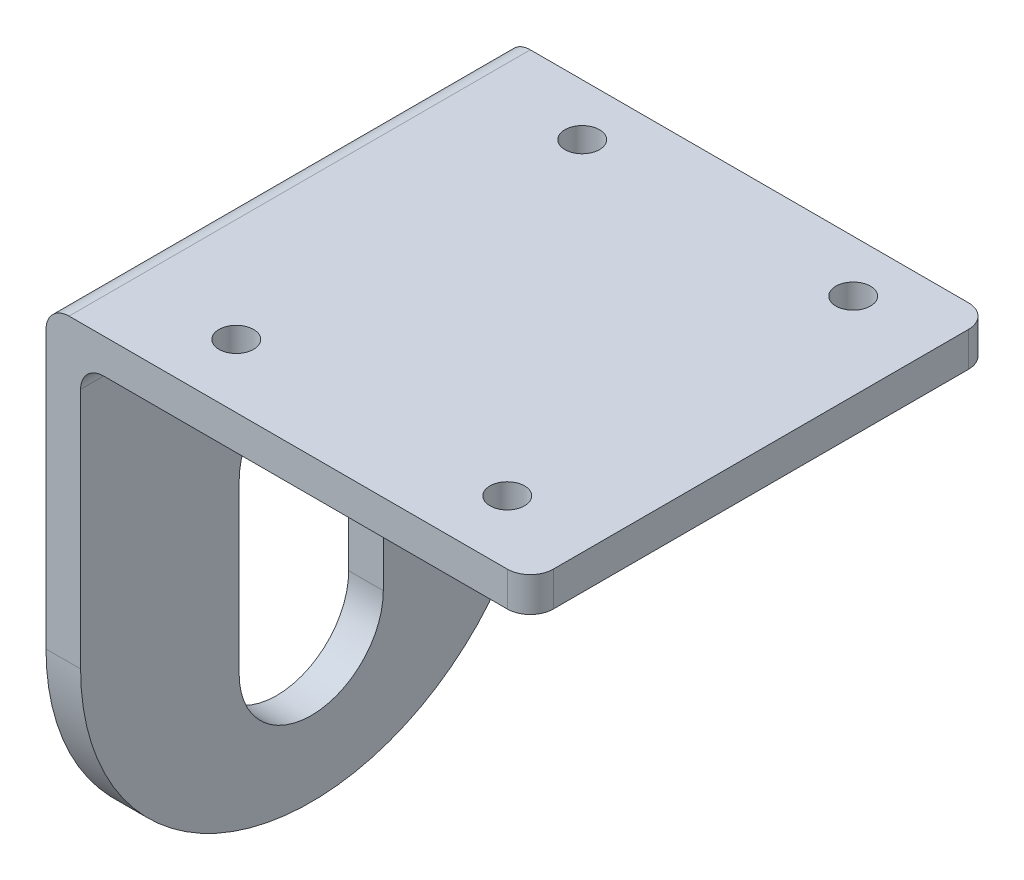
ISO-10303-21;
HEADER;
FILE_DESCRIPTION(('STEP AP214'),'2;1');
FILE_NAME('part.step','',(''),(''),'','','');
FILE_SCHEMA(('AUTOMOTIVE_DESIGN { 1 0 10303 214 1 1 1 1 }'));
ENDSEC;
DATA;
#1=APPLICATION_CONTEXT('core data for automotive mechanical design processes');
#2=APPLICATION_PROTOCOL_DEFINITION('international standard','automotive_design',2000,#1);
#3=PRODUCT_CONTEXT('',#1,'mechanical');
#4=PRODUCT('Part','Part','',(#3));
#5=PRODUCT_RELATED_PRODUCT_CATEGORY('part','',(#4));
#6=PRODUCT_DEFINITION_FORMATION('','',#4);
#7=PRODUCT_DEFINITION_CONTEXT('part definition',#1,'design');
#8=PRODUCT_DEFINITION('design','',#6,#7);
#9=PRODUCT_DEFINITION_SHAPE('','',#8);
#10=(LENGTH_UNIT() NAMED_UNIT(*) SI_UNIT(.MILLI.,.METRE.));
#11=(NAMED_UNIT(*) PLANE_ANGLE_UNIT() SI_UNIT($,.RADIAN.));
#12=(NAMED_UNIT(*) SI_UNIT($,.STERADIAN.) SOLID_ANGLE_UNIT());
#13=UNCERTAINTY_MEASURE_WITH_UNIT(LENGTH_MEASURE(1.E-05),#10,'distance_accuracy_value','');
#14=(GEOMETRIC_REPRESENTATION_CONTEXT(3) GLOBAL_UNCERTAINTY_ASSIGNED_CONTEXT((#13)) GLOBAL_UNIT_ASSIGNED_CONTEXT((#10,
#11,#12)) REPRESENTATION_CONTEXT('',''));
#15=CARTESIAN_POINT('',(0.,0.,0.));
#16=DIRECTION('',(0.,0.,1.));
#17=DIRECTION('',(1.,0.,0.));
#18=AXIS2_PLACEMENT_3D('',#15,#16,#17);
#19=CARTESIAN_POINT('',(0.,3.,-20.));
#20=DIRECTION('',(0.,0.,-1.));
#21=DIRECTION('',(-1.,0.,0.));
#22=AXIS2_PLACEMENT_3D('',#19,#20,#21);
#23=PLANE('',#22);
#24=DIRECTION('',(0.,-1.,0.));
#25=VECTOR('',#24,1.);
#26=CARTESIAN_POINT('',(-21.,-23.,-20.));
#27=LINE('',#26,#25);
#28=CARTESIAN_POINT('',(-21.,1.,-20.));
#29=VERTEX_POINT('',#28);
#30=CARTESIAN_POINT('',(-21.,-23.,-20.));
#31=VERTEX_POINT('',#30);
#32=EDGE_CURVE('E177',#29,#31,#27,.T.);
#33=ORIENTED_EDGE('',*,*,#32,.F.);
#34=CARTESIAN_POINT('',(-19.,1.,-20.));
#35=DIRECTION('',(0.,0.,-1.));
#36=DIRECTION('',(-1.,0.,0.));
#37=AXIS2_PLACEMENT_3D('',#34,#35,#36);
#38=CIRCLE('',#37,2.);
#39=CARTESIAN_POINT('',(-19.,3.,-20.));
#40=VERTEX_POINT('',#39);
#41=EDGE_CURVE('E257',#29,#40,#38,.T.);
#42=ORIENTED_EDGE('',*,*,#41,.T.);
#43=DIRECTION('',(1.,0.,0.));
#44=VECTOR('',#43,1.);
#45=CARTESIAN_POINT('',(0.,3.,-20.));
#46=LINE('',#45,#44);
#47=CARTESIAN_POINT('',(19.,3.,-20.));
#48=VERTEX_POINT('',#47);
#49=EDGE_CURVE('E211',#40,#48,#46,.T.);
#50=ORIENTED_EDGE('',*,*,#49,.T.);
#51=DIRECTION('',(0.,-1.,0.));
#52=VECTOR('',#51,1.);
#53=CARTESIAN_POINT('',(19.,3.,-20.));
#54=LINE('',#53,#52);
#55=CARTESIAN_POINT('',(19.,0.,-20.));
#56=VERTEX_POINT('',#55);
#57=EDGE_CURVE('E247',#48,#56,#54,.T.);
#58=ORIENTED_EDGE('',*,*,#57,.T.);
#59=DIRECTION('',(1.,0.,0.));
#60=VECTOR('',#59,1.);
#61=CARTESIAN_POINT('',(0.,0.,-20.));
#62=LINE('',#61,#60);
#63=CARTESIAN_POINT('',(-16.,0.,-20.));
#64=VERTEX_POINT('',#63);
#65=EDGE_CURVE('E237',#64,#56,#62,.T.);
#66=ORIENTED_EDGE('',*,*,#65,.F.);
#67=CARTESIAN_POINT('',(-16.,-2.,-20.));
#68=DIRECTION('',(0.,0.,-1.));
#69=DIRECTION('',(-1.,0.,0.));
#70=AXIS2_PLACEMENT_3D('',#67,#68,#69);
#71=CIRCLE('',#70,2.);
#72=CARTESIAN_POINT('',(-18.,-2.,-20.));
#73=VERTEX_POINT('',#72);
#74=EDGE_CURVE('E11',#64,#73,#71,.F.);
#75=ORIENTED_EDGE('',*,*,#74,.T.);
#76=DIRECTION('',(0.,-1.,0.));
#77=VECTOR('',#76,1.);
#78=CARTESIAN_POINT('',(-18.,-23.,-20.));
#79=LINE('',#78,#77);
#80=CARTESIAN_POINT('',(-18.,-23.,-20.));
#81=VERTEX_POINT('',#80);
#82=EDGE_CURVE('E153',#73,#81,#79,.T.);
#83=ORIENTED_EDGE('',*,*,#82,.T.);
#84=DIRECTION('',(1.,0.,0.));
#85=VECTOR('',#84,1.);
#86=CARTESIAN_POINT('',(-21.,-23.,-20.));
#87=LINE('',#86,#85);
#88=EDGE_CURVE('E192',#31,#81,#87,.T.);
#89=ORIENTED_EDGE('',*,*,#88,.F.);
#90=EDGE_LOOP('',(#33,#42,#50,#58,#66,#75,#83,#89));
#91=FACE_BOUND('',#90,.T.);
#92=ADVANCED_FACE('F34',(#91),#23,.T.);
#93=CARTESIAN_POINT('',(0.,3.,20.));
#94=DIRECTION('',(0.,0.,1.));
#95=DIRECTION('',(1.,0.,0.));
#96=AXIS2_PLACEMENT_3D('',#93,#94,#95);
#97=PLANE('',#96);
#98=DIRECTION('',(-1.,0.,0.));
#99=VECTOR('',#98,1.);
#100=CARTESIAN_POINT('',(0.,3.,20.));
#101=LINE('',#100,#99);
#102=CARTESIAN_POINT('',(19.,3.,20.));
#103=VERTEX_POINT('',#102);
#104=CARTESIAN_POINT('',(-19.,3.,20.));
#105=VERTEX_POINT('',#104);
#106=EDGE_CURVE('E213',#103,#105,#101,.T.);
#107=ORIENTED_EDGE('',*,*,#106,.T.);
#108=CARTESIAN_POINT('',(-19.,1.,20.));
#109=DIRECTION('',(0.,0.,1.));
#110=DIRECTION('',(1.,0.,0.));
#111=AXIS2_PLACEMENT_3D('',#108,#109,#110);
#112=CIRCLE('',#111,2.);
#113=CARTESIAN_POINT('',(-21.,1.,20.));
#114=VERTEX_POINT('',#113);
#115=EDGE_CURVE('E261',#105,#114,#112,.T.);
#116=ORIENTED_EDGE('',*,*,#115,.T.);
#117=DIRECTION('',(0.,1.,0.));
#118=VECTOR('',#117,1.);
#119=CARTESIAN_POINT('',(-21.,3.,20.));
#120=LINE('',#119,#118);
#121=CARTESIAN_POINT('',(-21.,-23.,20.));
#122=VERTEX_POINT('',#121);
#123=EDGE_CURVE('E182',#122,#114,#120,.T.);
#124=ORIENTED_EDGE('',*,*,#123,.F.);
#125=DIRECTION('',(1.,0.,0.));
#126=VECTOR('',#125,1.);
#127=CARTESIAN_POINT('',(-21.,-23.,20.));
#128=LINE('',#127,#126);
#129=CARTESIAN_POINT('',(-18.,-23.,20.));
#130=VERTEX_POINT('',#129);
#131=EDGE_CURVE('E185',#122,#130,#128,.T.);
#132=ORIENTED_EDGE('',*,*,#131,.T.);
#133=DIRECTION('',(0.,1.,0.));
#134=VECTOR('',#133,1.);
#135=CARTESIAN_POINT('',(-18.,3.,20.));
#136=LINE('',#135,#134);
#137=CARTESIAN_POINT('',(-18.,-2.,20.));
#138=VERTEX_POINT('',#137);
#139=EDGE_CURVE('E180',#130,#138,#136,.T.);
#140=ORIENTED_EDGE('',*,*,#139,.T.);
#141=CARTESIAN_POINT('',(-16.,-2.,20.));
#142=DIRECTION('',(0.,0.,1.));
#143=DIRECTION('',(1.,0.,0.));
#144=AXIS2_PLACEMENT_3D('',#141,#142,#143);
#145=CIRCLE('',#144,2.);
#146=CARTESIAN_POINT('',(-16.,0.,20.));
#147=VERTEX_POINT('',#146);
#148=EDGE_CURVE('E42',#138,#147,#145,.F.);
#149=ORIENTED_EDGE('',*,*,#148,.T.);
#150=DIRECTION('',(-1.,0.,0.));
#151=VECTOR('',#150,1.);
#152=CARTESIAN_POINT('',(0.,0.,20.));
#153=LINE('',#152,#151);
#154=CARTESIAN_POINT('',(19.,0.,20.));
#155=VERTEX_POINT('',#154);
#156=EDGE_CURVE('E239',#155,#147,#153,.T.);
#157=ORIENTED_EDGE('',*,*,#156,.F.);
#158=DIRECTION('',(0.,-1.,0.));
#159=VECTOR('',#158,1.);
#160=CARTESIAN_POINT('',(19.,3.,20.));
#161=LINE('',#160,#159);
#162=EDGE_CURVE('E222',#103,#155,#161,.T.);
#163=ORIENTED_EDGE('',*,*,#162,.F.);
#164=EDGE_LOOP('',(#107,#116,#124,#132,#140,#149,#157,#163));
#165=FACE_BOUND('',#164,.T.);
#166=ADVANCED_FACE('F274',(#165),#97,.T.);
#167=CARTESIAN_POINT('',(0.,3.,0.));
#168=DIRECTION('',(0.,1.,0.));
#169=DIRECTION('',(0.,0.,1.));
#170=AXIS2_PLACEMENT_3D('',#167,#168,#169);
#171=PLANE('',#170);
#172=CARTESIAN_POINT('',(13.5,3.,14.5));
#173=DIRECTION('',(0.,1.,0.));
#174=DIRECTION('',(0.,0.,1.));
#175=AXIS2_PLACEMENT_3D('',#172,#173,#174);
#176=CIRCLE('',#175,1.5);
#177=CARTESIAN_POINT('',(13.5,3.,16.));
#178=VERTEX_POINT('',#177);
#179=EDGE_CURVE('E196',#178,#178,#176,.T.);
#180=ORIENTED_EDGE('',*,*,#179,.F.);
#181=EDGE_LOOP('',(#180));
#182=FACE_BOUND('',#181,.T.);
#183=CARTESIAN_POINT('',(-9.99999999999999,3.,14.5));
#184=DIRECTION('',(0.,1.,0.));
#185=DIRECTION('',(0.,0.,1.));
#186=AXIS2_PLACEMENT_3D('',#183,#184,#185);
#187=CIRCLE('',#186,1.5);
#188=CARTESIAN_POINT('',(-9.99999999999999,3.,16.));
#189=VERTEX_POINT('',#188);
#190=EDGE_CURVE('E199',#189,#189,#187,.T.);
#191=ORIENTED_EDGE('',*,*,#190,.F.);
#192=EDGE_LOOP('',(#191));
#193=FACE_BOUND('',#192,.T.);
#194=CARTESIAN_POINT('',(-10.,3.,-15.5));
#195=DIRECTION('',(0.,1.,0.));
#196=DIRECTION('',(0.,0.,1.));
#197=AXIS2_PLACEMENT_3D('',#194,#195,#196);
#198=CIRCLE('',#197,1.5);
#199=CARTESIAN_POINT('',(-10.,3.,-14.));
#200=VERTEX_POINT('',#199);
#201=EDGE_CURVE('E216',#200,#200,#198,.T.);
#202=ORIENTED_EDGE('',*,*,#201,.F.);
#203=EDGE_LOOP('',(#202));
#204=FACE_BOUND('',#203,.T.);
#205=CARTESIAN_POINT('',(13.5,3.,-15.5));
#206=DIRECTION('',(0.,1.,0.));
#207=DIRECTION('',(0.,0.,1.));
#208=AXIS2_PLACEMENT_3D('',#205,#206,#207);
#209=CIRCLE('',#208,1.5);
#210=CARTESIAN_POINT('',(13.5,3.,-14.));
#211=VERTEX_POINT('',#210);
#212=EDGE_CURVE('E219',#211,#211,#209,.T.);
#213=ORIENTED_EDGE('',*,*,#212,.F.);
#214=EDGE_LOOP('',(#213));
#215=FACE_BOUND('',#214,.T.);
#216=ORIENTED_EDGE('',*,*,#49,.F.);
#217=DIRECTION('',(0.,0.,-1.));
#218=VECTOR('',#217,1.);
#219=CARTESIAN_POINT('',(-19.,3.,0.));
#220=LINE('',#219,#218);
#221=EDGE_CURVE('E259',#40,#105,#220,.F.);
#222=ORIENTED_EDGE('',*,*,#221,.T.);
#223=ORIENTED_EDGE('',*,*,#106,.F.);
#224=CARTESIAN_POINT('',(19.,3.,18.));
#225=DIRECTION('',(0.,1.,0.));
#226=DIRECTION('',(0.,0.,1.));
#227=AXIS2_PLACEMENT_3D('',#224,#225,#226);
#228=CIRCLE('',#227,2.);
#229=CARTESIAN_POINT('',(21.,3.,18.));
#230=VERTEX_POINT('',#229);
#231=EDGE_CURVE('E203',#230,#103,#228,.F.);
#232=ORIENTED_EDGE('',*,*,#231,.F.);
#233=DIRECTION('',(0.,0.,-1.));
#234=VECTOR('',#233,1.);
#235=CARTESIAN_POINT('',(21.,3.,0.));
#236=LINE('',#235,#234);
#237=CARTESIAN_POINT('',(21.,3.,-18.));
#238=VERTEX_POINT('',#237);
#239=EDGE_CURVE('E206',#230,#238,#236,.T.);
#240=ORIENTED_EDGE('',*,*,#239,.T.);
#241=CARTESIAN_POINT('',(19.,3.,-18.));
#242=DIRECTION('',(0.,1.,0.));
#243=DIRECTION('',(0.,0.,1.));
#244=AXIS2_PLACEMENT_3D('',#241,#242,#243);
#245=CIRCLE('',#244,2.);
#246=EDGE_CURVE('E208',#48,#238,#245,.F.);
#247=ORIENTED_EDGE('',*,*,#246,.F.);
#248=EDGE_LOOP('',(#216,#222,#223,#232,#240,#247));
#249=FACE_BOUND('',#248,.T.);
#250=ADVANCED_FACE('F295',(#182,#193,#204,#215,#249),#171,.T.);
#251=CARTESIAN_POINT('',(0.,0.,0.));
#252=DIRECTION('',(0.,1.,0.));
#253=DIRECTION('',(0.,0.,1.));
#254=AXIS2_PLACEMENT_3D('',#251,#252,#253);
#255=PLANE('',#254);
#256=CARTESIAN_POINT('',(13.5,0.,-15.5));
#257=DIRECTION('',(0.,1.,0.));
#258=DIRECTION('',(0.,0.,1.));
#259=AXIS2_PLACEMENT_3D('',#256,#257,#258);
#260=CIRCLE('',#259,1.5);
#261=CARTESIAN_POINT('',(13.5,0.,-14.));
#262=VERTEX_POINT('',#261);
#263=EDGE_CURVE('E200',#262,#262,#260,.T.);
#264=ORIENTED_EDGE('',*,*,#263,.T.);
#265=EDGE_LOOP('',(#264));
#266=FACE_BOUND('',#265,.T.);
#267=CARTESIAN_POINT('',(-10.,0.,-15.5));
#268=DIRECTION('',(0.,1.,0.));
#269=DIRECTION('',(0.,0.,1.));
#270=AXIS2_PLACEMENT_3D('',#267,#268,#269);
#271=CIRCLE('',#270,1.5);
#272=CARTESIAN_POINT('',(-10.,0.,-14.));
#273=VERTEX_POINT('',#272);
#274=EDGE_CURVE('E241',#273,#273,#271,.T.);
#275=ORIENTED_EDGE('',*,*,#274,.T.);
#276=EDGE_LOOP('',(#275));
#277=FACE_BOUND('',#276,.T.);
#278=CARTESIAN_POINT('',(-9.99999999999999,0.,14.5));
#279=DIRECTION('',(0.,1.,0.));
#280=DIRECTION('',(0.,0.,1.));
#281=AXIS2_PLACEMENT_3D('',#278,#279,#280);
#282=CIRCLE('',#281,1.5);
#283=CARTESIAN_POINT('',(-9.99999999999999,0.,16.));
#284=VERTEX_POINT('',#283);
#285=EDGE_CURVE('E225',#284,#284,#282,.T.);
#286=ORIENTED_EDGE('',*,*,#285,.T.);
#287=EDGE_LOOP('',(#286));
#288=FACE_BOUND('',#287,.T.);
#289=CARTESIAN_POINT('',(13.5,0.,14.5));
#290=DIRECTION('',(0.,1.,0.));
#291=DIRECTION('',(0.,0.,1.));
#292=AXIS2_PLACEMENT_3D('',#289,#290,#291);
#293=CIRCLE('',#292,1.5);
#294=CARTESIAN_POINT('',(13.5,0.,16.));
#295=VERTEX_POINT('',#294);
#296=EDGE_CURVE('E195',#295,#295,#293,.T.);
#297=ORIENTED_EDGE('',*,*,#296,.T.);
#298=EDGE_LOOP('',(#297));
#299=FACE_BOUND('',#298,.T.);
#300=ORIENTED_EDGE('',*,*,#156,.T.);
#301=DIRECTION('',(0.,0.,1.));
#302=VECTOR('',#301,1.);
#303=CARTESIAN_POINT('',(-16.,0.,-20.));
#304=LINE('',#303,#302);
#305=EDGE_CURVE('E55',#147,#64,#304,.F.);
#306=ORIENTED_EDGE('',*,*,#305,.T.);
#307=ORIENTED_EDGE('',*,*,#65,.T.);
#308=CARTESIAN_POINT('',(19.,0.,-18.));
#309=DIRECTION('',(0.,1.,0.));
#310=DIRECTION('',(0.,0.,1.));
#311=AXIS2_PLACEMENT_3D('',#308,#309,#310);
#312=CIRCLE('',#311,2.);
#313=CARTESIAN_POINT('',(21.,0.,-18.));
#314=VERTEX_POINT('',#313);
#315=EDGE_CURVE('E234',#56,#314,#312,.F.);
#316=ORIENTED_EDGE('',*,*,#315,.T.);
#317=DIRECTION('',(0.,0.,-1.));
#318=VECTOR('',#317,1.);
#319=CARTESIAN_POINT('',(21.,0.,0.));
#320=LINE('',#319,#318);
#321=CARTESIAN_POINT('',(21.,0.,18.));
#322=VERTEX_POINT('',#321);
#323=EDGE_CURVE('E231',#322,#314,#320,.T.);
#324=ORIENTED_EDGE('',*,*,#323,.F.);
#325=CARTESIAN_POINT('',(19.,0.,18.));
#326=DIRECTION('',(0.,1.,0.));
#327=DIRECTION('',(0.,0.,1.));
#328=AXIS2_PLACEMENT_3D('',#325,#326,#327);
#329=CIRCLE('',#328,2.);
#330=EDGE_CURVE('E228',#322,#155,#329,.F.);
#331=ORIENTED_EDGE('',*,*,#330,.T.);
#332=EDGE_LOOP('',(#300,#306,#307,#316,#324,#331));
#333=FACE_BOUND('',#332,.T.);
#334=ADVANCED_FACE('F311',(#266,#277,#288,#299,#333),#255,.F.);
#335=CARTESIAN_POINT('',(19.,3.,18.));
#336=DIRECTION('',(0.,-1.,0.));
#337=DIRECTION('',(0.,0.,-1.));
#338=AXIS2_PLACEMENT_3D('',#335,#336,#337);
#339=CYLINDRICAL_SURFACE('',#338,2.);
#340=ORIENTED_EDGE('',*,*,#330,.F.);
#341=DIRECTION('',(0.,-1.,0.));
#342=VECTOR('',#341,1.);
#343=CARTESIAN_POINT('',(21.,3.,18.));
#344=LINE('',#343,#342);
#345=EDGE_CURVE('E252',#230,#322,#344,.T.);
#346=ORIENTED_EDGE('',*,*,#345,.F.);
#347=ORIENTED_EDGE('',*,*,#231,.T.);
#348=ORIENTED_EDGE('',*,*,#162,.T.);
#349=EDGE_LOOP('',(#340,#346,#347,#348));
#350=FACE_BOUND('',#349,.T.);
#351=ADVANCED_FACE('F307',(#350),#339,.T.);
#352=CARTESIAN_POINT('',(21.,3.,0.));
#353=DIRECTION('',(-1.,0.,0.));
#354=DIRECTION('',(0.,0.,1.));
#355=AXIS2_PLACEMENT_3D('',#352,#353,#354);
#356=PLANE('',#355);
#357=ORIENTED_EDGE('',*,*,#323,.T.);
#358=DIRECTION('',(0.,-1.,0.));
#359=VECTOR('',#358,1.);
#360=CARTESIAN_POINT('',(21.,3.,-18.));
#361=LINE('',#360,#359);
#362=EDGE_CURVE('E250',#238,#314,#361,.T.);
#363=ORIENTED_EDGE('',*,*,#362,.F.);
#364=ORIENTED_EDGE('',*,*,#239,.F.);
#365=ORIENTED_EDGE('',*,*,#345,.T.);
#366=EDGE_LOOP('',(#357,#363,#364,#365));
#367=FACE_BOUND('',#366,.T.);
#368=ADVANCED_FACE('F303',(#367),#356,.F.);
#369=CARTESIAN_POINT('',(19.,3.,-18.));
#370=DIRECTION('',(0.,-1.,0.));
#371=DIRECTION('',(0.,0.,-1.));
#372=AXIS2_PLACEMENT_3D('',#369,#370,#371);
#373=CYLINDRICAL_SURFACE('',#372,2.);
#374=ORIENTED_EDGE('',*,*,#315,.F.);
#375=ORIENTED_EDGE('',*,*,#57,.F.);
#376=ORIENTED_EDGE('',*,*,#246,.T.);
#377=ORIENTED_EDGE('',*,*,#362,.T.);
#378=EDGE_LOOP('',(#374,#375,#376,#377));
#379=FACE_BOUND('',#378,.T.);
#380=ADVANCED_FACE('F299',(#379),#373,.T.);
#381=CARTESIAN_POINT('',(-10.,3.,-15.5));
#382=DIRECTION('',(0.,-1.,0.));
#383=DIRECTION('',(0.,0.,-1.));
#384=AXIS2_PLACEMENT_3D('',#381,#382,#383);
#385=CYLINDRICAL_SURFACE('',#384,1.5);
#386=ORIENTED_EDGE('',*,*,#201,.T.);
#387=EDGE_LOOP('',(#386));
#388=FACE_BOUND('',#387,.T.);
#389=ORIENTED_EDGE('',*,*,#274,.F.);
#390=EDGE_LOOP('',(#389));
#391=FACE_BOUND('',#390,.T.);
#392=ADVANCED_FACE('F302',(#388,#391),#385,.F.);
#393=CARTESIAN_POINT('',(-9.99999999999999,3.,14.5));
#394=DIRECTION('',(0.,-1.,0.));
#395=DIRECTION('',(0.,0.,-1.));
#396=AXIS2_PLACEMENT_3D('',#393,#394,#395);
#397=CYLINDRICAL_SURFACE('',#396,1.5);
#398=ORIENTED_EDGE('',*,*,#190,.T.);
#399=EDGE_LOOP('',(#398));
#400=FACE_BOUND('',#399,.T.);
#401=ORIENTED_EDGE('',*,*,#285,.F.);
#402=EDGE_LOOP('',(#401));
#403=FACE_BOUND('',#402,.T.);
#404=ADVANCED_FACE('F313',(#400,#403),#397,.F.);
#405=CARTESIAN_POINT('',(13.5,3.,14.5));
#406=DIRECTION('',(0.,-1.,0.));
#407=DIRECTION('',(0.,0.,-1.));
#408=AXIS2_PLACEMENT_3D('',#405,#406,#407);
#409=CYLINDRICAL_SURFACE('',#408,1.5);
#410=ORIENTED_EDGE('',*,*,#179,.T.);
#411=EDGE_LOOP('',(#410));
#412=FACE_BOUND('',#411,.T.);
#413=ORIENTED_EDGE('',*,*,#296,.F.);
#414=EDGE_LOOP('',(#413));
#415=FACE_BOUND('',#414,.T.);
#416=ADVANCED_FACE('F316',(#412,#415),#409,.F.);
#417=CARTESIAN_POINT('',(13.5,3.,-15.5));
#418=DIRECTION('',(0.,-1.,0.));
#419=DIRECTION('',(0.,0.,-1.));
#420=AXIS2_PLACEMENT_3D('',#417,#418,#419);
#421=CYLINDRICAL_SURFACE('',#420,1.5);
#422=ORIENTED_EDGE('',*,*,#212,.T.);
#423=EDGE_LOOP('',(#422));
#424=FACE_BOUND('',#423,.T.);
#425=ORIENTED_EDGE('',*,*,#263,.F.);
#426=EDGE_LOOP('',(#425));
#427=FACE_BOUND('',#426,.T.);
#428=ADVANCED_FACE('F319',(#424,#427),#421,.F.);
#429=CARTESIAN_POINT('',(-18.,-23.,0.));
#430=DIRECTION('',(-1.,0.,0.));
#431=DIRECTION('',(0.,0.,1.));
#432=AXIS2_PLACEMENT_3D('',#429,#430,#431);
#433=PLANE('',#432);
#434=CARTESIAN_POINT('',(-18.,-30.25,0.));
#435=DIRECTION('',(-1.,0.,0.));
#436=DIRECTION('',(0.,0.,1.));
#437=AXIS2_PLACEMENT_3D('',#434,#435,#436);
#438=CIRCLE('',#437,6.25);
#439=CARTESIAN_POINT('',(-18.,-30.25,-6.25));
#440=VERTEX_POINT('',#439);
#441=CARTESIAN_POINT('',(-18.,-30.25,6.25));
#442=VERTEX_POINT('',#441);
#443=EDGE_CURVE('E165',#440,#442,#438,.T.);
#444=ORIENTED_EDGE('',*,*,#443,.T.);
#445=DIRECTION('',(0.,1.,0.));
#446=VECTOR('',#445,1.);
#447=CARTESIAN_POINT('',(-18.,-30.25,6.25));
#448=LINE('',#447,#446);
#449=CARTESIAN_POINT('',(-18.,-15.75,6.25));
#450=VERTEX_POINT('',#449);
#451=EDGE_CURVE('E152',#442,#450,#448,.T.);
#452=ORIENTED_EDGE('',*,*,#451,.T.);
#453=CARTESIAN_POINT('',(-18.,-15.75,0.));
#454=DIRECTION('',(-1.,0.,0.));
#455=DIRECTION('',(0.,0.,1.));
#456=AXIS2_PLACEMENT_3D('',#453,#454,#455);
#457=CIRCLE('',#456,6.25);
#458=CARTESIAN_POINT('',(-18.,-15.75,-6.25));
#459=VERTEX_POINT('',#458);
#460=EDGE_CURVE('E168',#450,#459,#457,.T.);
#461=ORIENTED_EDGE('',*,*,#460,.T.);
#462=DIRECTION('',(0.,-1.,0.));
#463=VECTOR('',#462,1.);
#464=CARTESIAN_POINT('',(-18.,-30.25,-6.25));
#465=LINE('',#464,#463);
#466=EDGE_CURVE('E146',#459,#440,#465,.T.);
#467=ORIENTED_EDGE('',*,*,#466,.T.);
#468=EDGE_LOOP('',(#444,#452,#461,#467));
#469=FACE_BOUND('',#468,.T.);
#470=ORIENTED_EDGE('',*,*,#82,.F.);
#471=DIRECTION('',(0.,0.,1.));
#472=VECTOR('',#471,1.);
#473=CARTESIAN_POINT('',(-18.,-2.,20.));
#474=LINE('',#473,#472);
#475=EDGE_CURVE('E263',#73,#138,#474,.T.);
#476=ORIENTED_EDGE('',*,*,#475,.T.);
#477=ORIENTED_EDGE('',*,*,#139,.F.);
#478=CARTESIAN_POINT('',(-18.,-23.,0.));
#479=DIRECTION('',(-1.,0.,0.));
#480=DIRECTION('',(0.,0.,1.));
#481=AXIS2_PLACEMENT_3D('',#478,#479,#480);
#482=CIRCLE('',#481,20.);
#483=EDGE_CURVE('E187',#81,#130,#482,.T.);
#484=ORIENTED_EDGE('',*,*,#483,.F.);
#485=EDGE_LOOP('',(#470,#476,#477,#484));
#486=FACE_BOUND('',#485,.T.);
#487=ADVANCED_FACE('F270',(#469,#486),#433,.F.);
#488=CARTESIAN_POINT('',(-21.,-23.,0.));
#489=DIRECTION('',(-1.,0.,0.));
#490=DIRECTION('',(0.,0.,1.));
#491=AXIS2_PLACEMENT_3D('',#488,#489,#490);
#492=PLANE('',#491);
#493=ORIENTED_EDGE('',*,*,#123,.T.);
#494=DIRECTION('',(0.,0.,-1.));
#495=VECTOR('',#494,1.);
#496=CARTESIAN_POINT('',(-21.,1.,0.));
#497=LINE('',#496,#495);
#498=EDGE_CURVE('E254',#114,#29,#497,.T.);
#499=ORIENTED_EDGE('',*,*,#498,.T.);
#500=ORIENTED_EDGE('',*,*,#32,.T.);
#501=CARTESIAN_POINT('',(-21.,-23.,0.));
#502=DIRECTION('',(-1.,0.,0.));
#503=DIRECTION('',(0.,0.,1.));
#504=AXIS2_PLACEMENT_3D('',#501,#502,#503);
#505=CIRCLE('',#504,20.);
#506=EDGE_CURVE('E179',#31,#122,#505,.T.);
#507=ORIENTED_EDGE('',*,*,#506,.T.);
#508=EDGE_LOOP('',(#493,#499,#500,#507));
#509=FACE_BOUND('',#508,.T.);
#510=DIRECTION('',(0.,1.,0.));
#511=VECTOR('',#510,1.);
#512=CARTESIAN_POINT('',(-21.,-30.25,6.25));
#513=LINE('',#512,#511);
#514=CARTESIAN_POINT('',(-21.,-30.25,6.25));
#515=VERTEX_POINT('',#514);
#516=CARTESIAN_POINT('',(-21.,-15.75,6.25));
#517=VERTEX_POINT('',#516);
#518=EDGE_CURVE('E145',#515,#517,#513,.T.);
#519=ORIENTED_EDGE('',*,*,#518,.F.);
#520=CARTESIAN_POINT('',(-21.,-30.25,0.));
#521=DIRECTION('',(-1.,0.,0.));
#522=DIRECTION('',(0.,0.,1.));
#523=AXIS2_PLACEMENT_3D('',#520,#521,#522);
#524=CIRCLE('',#523,6.25);
#525=CARTESIAN_POINT('',(-21.,-30.25,-6.25));
#526=VERTEX_POINT('',#525);
#527=EDGE_CURVE('E135',#526,#515,#524,.T.);
#528=ORIENTED_EDGE('',*,*,#527,.F.);
#529=DIRECTION('',(0.,-1.,0.));
#530=VECTOR('',#529,1.);
#531=CARTESIAN_POINT('',(-21.,-30.25,-6.25));
#532=LINE('',#531,#530);
#533=CARTESIAN_POINT('',(-21.,-15.75,-6.25));
#534=VERTEX_POINT('',#533);
#535=EDGE_CURVE('E161',#534,#526,#532,.T.);
#536=ORIENTED_EDGE('',*,*,#535,.F.);
#537=CARTESIAN_POINT('',(-21.,-15.75,0.));
#538=DIRECTION('',(-1.,0.,0.));
#539=DIRECTION('',(0.,0.,1.));
#540=AXIS2_PLACEMENT_3D('',#537,#538,#539);
#541=CIRCLE('',#540,6.25);
#542=EDGE_CURVE('E159',#517,#534,#541,.T.);
#543=ORIENTED_EDGE('',*,*,#542,.F.);
#544=EDGE_LOOP('',(#519,#528,#536,#543));
#545=FACE_BOUND('',#544,.T.);
#546=ADVANCED_FACE('F157',(#509,#545),#492,.T.);
#547=CARTESIAN_POINT('',(-21.,-23.,0.));
#548=DIRECTION('',(1.,0.,0.));
#549=DIRECTION('',(0.,0.,-1.));
#550=AXIS2_PLACEMENT_3D('',#547,#548,#549);
#551=CYLINDRICAL_SURFACE('',#550,20.);
#552=ORIENTED_EDGE('',*,*,#483,.T.);
#553=ORIENTED_EDGE('',*,*,#131,.F.);
#554=ORIENTED_EDGE('',*,*,#506,.F.);
#555=ORIENTED_EDGE('',*,*,#88,.T.);
#556=EDGE_LOOP('',(#552,#553,#554,#555));
#557=FACE_BOUND('',#556,.T.);
#558=ADVANCED_FACE('F279',(#557),#551,.T.);
#559=CARTESIAN_POINT('',(-21.,-30.25,0.));
#560=DIRECTION('',(1.,0.,0.));
#561=DIRECTION('',(0.,0.,-1.));
#562=AXIS2_PLACEMENT_3D('',#559,#560,#561);
#563=CYLINDRICAL_SURFACE('',#562,6.25);
#564=ORIENTED_EDGE('',*,*,#443,.F.);
#565=DIRECTION('',(1.,0.,0.));
#566=VECTOR('',#565,1.);
#567=CARTESIAN_POINT('',(-21.,-30.25,-6.25));
#568=LINE('',#567,#566);
#569=EDGE_CURVE('E141',#526,#440,#568,.T.);
#570=ORIENTED_EDGE('',*,*,#569,.F.);
#571=ORIENTED_EDGE('',*,*,#527,.T.);
#572=DIRECTION('',(1.,0.,0.));
#573=VECTOR('',#572,1.);
#574=CARTESIAN_POINT('',(-21.,-30.25,6.25));
#575=LINE('',#574,#573);
#576=EDGE_CURVE('E138',#515,#442,#575,.T.);
#577=ORIENTED_EDGE('',*,*,#576,.T.);
#578=EDGE_LOOP('',(#564,#570,#571,#577));
#579=FACE_BOUND('',#578,.T.);
#580=ADVANCED_FACE('F137',(#579),#563,.F.);
#581=CARTESIAN_POINT('',(-21.,-30.25,6.25));
#582=DIRECTION('',(0.,0.,-1.));
#583=DIRECTION('',(-1.,0.,0.));
#584=AXIS2_PLACEMENT_3D('',#581,#582,#583);
#585=PLANE('',#584);
#586=ORIENTED_EDGE('',*,*,#451,.F.);
#587=ORIENTED_EDGE('',*,*,#576,.F.);
#588=ORIENTED_EDGE('',*,*,#518,.T.);
#589=DIRECTION('',(1.,0.,0.));
#590=VECTOR('',#589,1.);
#591=CARTESIAN_POINT('',(-21.,-15.75,6.25));
#592=LINE('',#591,#590);
#593=EDGE_CURVE('E154',#517,#450,#592,.T.);
#594=ORIENTED_EDGE('',*,*,#593,.T.);
#595=EDGE_LOOP('',(#586,#587,#588,#594));
#596=FACE_BOUND('',#595,.T.);
#597=ADVANCED_FACE('F149',(#596),#585,.T.);
#598=CARTESIAN_POINT('',(-21.,-15.75,0.));
#599=DIRECTION('',(1.,0.,0.));
#600=DIRECTION('',(0.,0.,-1.));
#601=AXIS2_PLACEMENT_3D('',#598,#599,#600);
#602=CYLINDRICAL_SURFACE('',#601,6.25);
#603=ORIENTED_EDGE('',*,*,#460,.F.);
#604=ORIENTED_EDGE('',*,*,#593,.F.);
#605=ORIENTED_EDGE('',*,*,#542,.T.);
#606=DIRECTION('',(1.,0.,0.));
#607=VECTOR('',#606,1.);
#608=CARTESIAN_POINT('',(-21.,-15.75,-6.25));
#609=LINE('',#608,#607);
#610=EDGE_CURVE('E174',#534,#459,#609,.T.);
#611=ORIENTED_EDGE('',*,*,#610,.T.);
#612=EDGE_LOOP('',(#603,#604,#605,#611));
#613=FACE_BOUND('',#612,.T.);
#614=ADVANCED_FACE('F415',(#613),#602,.F.);
#615=CARTESIAN_POINT('',(-21.,-30.25,-6.25));
#616=DIRECTION('',(0.,0.,1.));
#617=DIRECTION('',(1.,0.,0.));
#618=AXIS2_PLACEMENT_3D('',#615,#616,#617);
#619=PLANE('',#618);
#620=ORIENTED_EDGE('',*,*,#466,.F.);
#621=ORIENTED_EDGE('',*,*,#610,.F.);
#622=ORIENTED_EDGE('',*,*,#535,.T.);
#623=ORIENTED_EDGE('',*,*,#569,.T.);
#624=EDGE_LOOP('',(#620,#621,#622,#623));
#625=FACE_BOUND('',#624,.T.);
#626=ADVANCED_FACE('F288',(#625),#619,.T.);
#627=CARTESIAN_POINT('',(-19.,1.,0.));
#628=DIRECTION('',(0.,0.,-1.));
#629=DIRECTION('',(-1.,0.,0.));
#630=AXIS2_PLACEMENT_3D('',#627,#628,#629);
#631=CYLINDRICAL_SURFACE('',#630,2.);
#632=ORIENTED_EDGE('',*,*,#115,.F.);
#633=ORIENTED_EDGE('',*,*,#221,.F.);
#634=ORIENTED_EDGE('',*,*,#41,.F.);
#635=ORIENTED_EDGE('',*,*,#498,.F.);
#636=EDGE_LOOP('',(#632,#633,#634,#635));
#637=FACE_BOUND('',#636,.T.);
#638=ADVANCED_FACE('F284',(#637),#631,.T.);
#639=CARTESIAN_POINT('',(-16.,-2.,0.));
#640=DIRECTION('',(0.,0.,-1.));
#641=DIRECTION('',(-1.,0.,0.));
#642=AXIS2_PLACEMENT_3D('',#639,#640,#641);
#643=CYLINDRICAL_SURFACE('',#642,2.);
#644=ORIENTED_EDGE('',*,*,#74,.F.);
#645=ORIENTED_EDGE('',*,*,#305,.F.);
#646=ORIENTED_EDGE('',*,*,#148,.F.);
#647=ORIENTED_EDGE('',*,*,#475,.F.);
#648=EDGE_LOOP('',(#644,#645,#646,#647));
#649=FACE_BOUND('',#648,.T.);
#650=ADVANCED_FACE('F36',(#649),#643,.F.);
#651=CLOSED_SHELL('',(#92,#166,#250,#334,#351,#368,#380,#392,#404,#416,#428,#487,#546,#558,#580,
#597,#614,#626,#638,#650));
#652=MANIFOLD_SOLID_BREP('B2',#651);
#653=ADVANCED_BREP_SHAPE_REPRESENTATION('',(#18,#652),#14);
#654=SHAPE_DEFINITION_REPRESENTATION(#9,#653);
ENDSEC;
END-ISO-10303-21;
